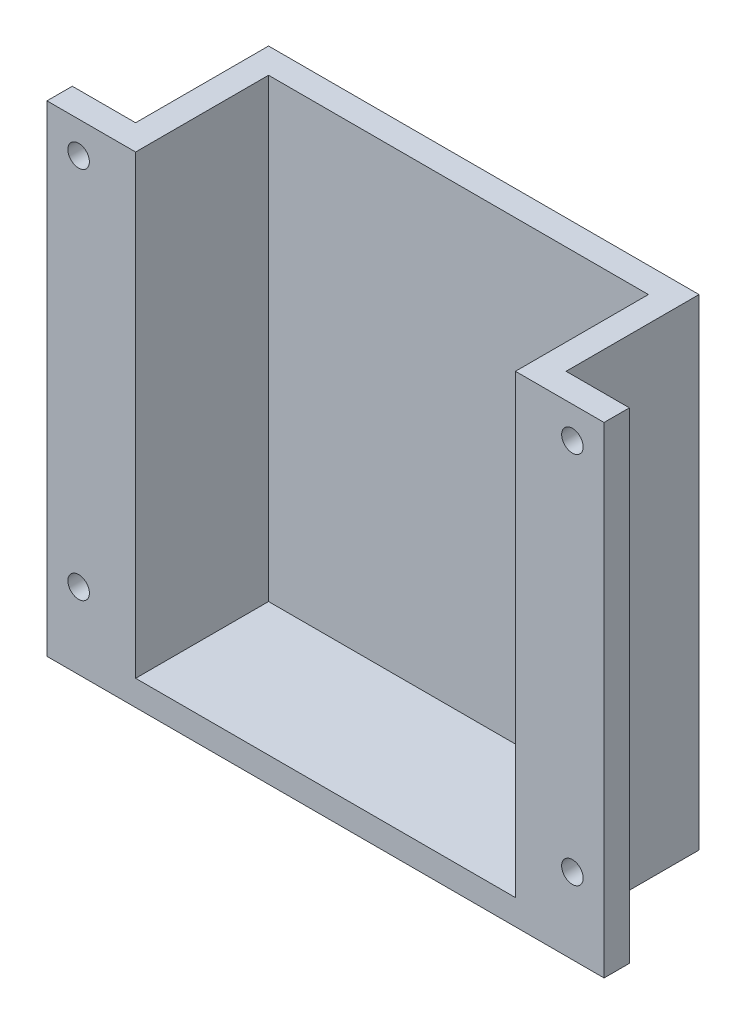
ISO-10303-21;
HEADER;
FILE_DESCRIPTION(('STEP AP214'),'2;1');
FILE_NAME('part.step','',(''),(''),'','','');
FILE_SCHEMA(('AUTOMOTIVE_DESIGN { 1 0 10303 214 1 1 1 1 }'));
ENDSEC;
DATA;
#1=APPLICATION_CONTEXT('core data for automotive mechanical design processes');
#2=APPLICATION_PROTOCOL_DEFINITION('international standard','automotive_design',2000,#1);
#3=PRODUCT_CONTEXT('',#1,'mechanical');
#4=PRODUCT('Part','Part','',(#3));
#5=PRODUCT_RELATED_PRODUCT_CATEGORY('part','',(#4));
#6=PRODUCT_DEFINITION_FORMATION('','',#4);
#7=PRODUCT_DEFINITION_CONTEXT('part definition',#1,'design');
#8=PRODUCT_DEFINITION('design','',#6,#7);
#9=PRODUCT_DEFINITION_SHAPE('','',#8);
#10=(LENGTH_UNIT() NAMED_UNIT(*) SI_UNIT(.MILLI.,.METRE.));
#11=(NAMED_UNIT(*) PLANE_ANGLE_UNIT() SI_UNIT($,.RADIAN.));
#12=(NAMED_UNIT(*) SI_UNIT($,.STERADIAN.) SOLID_ANGLE_UNIT());
#13=UNCERTAINTY_MEASURE_WITH_UNIT(LENGTH_MEASURE(1.E-05),#10,'distance_accuracy_value','');
#14=(GEOMETRIC_REPRESENTATION_CONTEXT(3) GLOBAL_UNCERTAINTY_ASSIGNED_CONTEXT((#13)) GLOBAL_UNIT_ASSIGNED_CONTEXT((#10,
#11,#12)) REPRESENTATION_CONTEXT('',''));
#15=CARTESIAN_POINT('',(0.,0.,0.));
#16=DIRECTION('',(0.,0.,1.));
#17=DIRECTION('',(1.,0.,0.));
#18=AXIS2_PLACEMENT_3D('',#15,#16,#17);
#19=CARTESIAN_POINT('',(29.8333333333333,76.,0.));
#20=DIRECTION('',(0.,0.,-1.));
#21=DIRECTION('',(-1.,0.,0.));
#22=AXIS2_PLACEMENT_3D('',#19,#20,#21);
#23=PLANE('',#22);
#24=CARTESIAN_POINT('',(34.8333333333333,12.,0.));
#25=DIRECTION('',(0.,0.,-1.));
#26=DIRECTION('',(-1.,0.,0.));
#27=AXIS2_PLACEMENT_3D('',#24,#25,#26);
#28=CIRCLE('',#27,1.7);
#29=CARTESIAN_POINT('',(33.1333333333333,12.,0.));
#30=VERTEX_POINT('',#29);
#31=EDGE_CURVE('E337',#30,#30,#28,.T.);
#32=ORIENTED_EDGE('',*,*,#31,.F.);
#33=EDGE_LOOP('',(#32));
#34=FACE_BOUND('',#33,.T.);
#35=CARTESIAN_POINT('',(34.8333333333333,71.,0.));
#36=DIRECTION('',(0.,0.,-1.));
#37=DIRECTION('',(-1.,0.,0.));
#38=AXIS2_PLACEMENT_3D('',#35,#36,#37);
#39=CIRCLE('',#38,1.7);
#40=CARTESIAN_POINT('',(33.1333333333333,71.,0.));
#41=VERTEX_POINT('',#40);
#42=EDGE_CURVE('E258',#41,#41,#39,.T.);
#43=ORIENTED_EDGE('',*,*,#42,.F.);
#44=EDGE_LOOP('',(#43));
#45=FACE_BOUND('',#44,.T.);
#46=DIRECTION('',(1.,0.,0.));
#47=VECTOR('',#46,1.);
#48=CARTESIAN_POINT('',(29.8333333333333,0.,0.));
#49=LINE('',#48,#47);
#50=CARTESIAN_POINT('',(29.8333333333333,0.,0.));
#51=VERTEX_POINT('',#50);
#52=CARTESIAN_POINT('',(39.8333333333333,0.,0.));
#53=VERTEX_POINT('',#52);
#54=EDGE_CURVE('E201',#51,#53,#49,.T.);
#55=ORIENTED_EDGE('',*,*,#54,.F.);
#56=DIRECTION('',(0.,-1.,0.));
#57=VECTOR('',#56,1.);
#58=CARTESIAN_POINT('',(29.8333333333333,76.,0.));
#59=LINE('',#58,#57);
#60=CARTESIAN_POINT('',(29.8333333333333,76.,0.));
#61=VERTEX_POINT('',#60);
#62=EDGE_CURVE('E11',#61,#51,#59,.T.);
#63=ORIENTED_EDGE('',*,*,#62,.F.);
#64=DIRECTION('',(1.,0.,0.));
#65=VECTOR('',#64,1.);
#66=CARTESIAN_POINT('',(29.8333333333333,76.,0.));
#67=LINE('',#66,#65);
#68=CARTESIAN_POINT('',(39.8333333333333,76.,0.));
#69=VERTEX_POINT('',#68);
#70=EDGE_CURVE('E152',#61,#69,#67,.T.);
#71=ORIENTED_EDGE('',*,*,#70,.T.);
#72=DIRECTION('',(0.,-1.,0.));
#73=VECTOR('',#72,1.);
#74=CARTESIAN_POINT('',(39.8333333333333,76.,0.));
#75=LINE('',#74,#73);
#76=EDGE_CURVE('E133',#69,#53,#75,.T.);
#77=ORIENTED_EDGE('',*,*,#76,.T.);
#78=EDGE_LOOP('',(#55,#63,#71,#77));
#79=FACE_BOUND('',#78,.T.);
#80=ADVANCED_FACE('F43',(#34,#45,#79),#23,.T.);
#81=CARTESIAN_POINT('',(29.8333333333333,76.,-21.));
#82=DIRECTION('',(1.,0.,0.));
#83=DIRECTION('',(0.,0.,-1.));
#84=AXIS2_PLACEMENT_3D('',#81,#82,#83);
#85=PLANE('',#84);
#86=DIRECTION('',(0.,0.,1.));
#87=VECTOR('',#86,1.);
#88=CARTESIAN_POINT('',(29.8333333333333,0.,-21.));
#89=LINE('',#88,#87);
#90=CARTESIAN_POINT('',(29.8333333333333,0.,-21.));
#91=VERTEX_POINT('',#90);
#92=EDGE_CURVE('E160',#91,#51,#89,.T.);
#93=ORIENTED_EDGE('',*,*,#92,.F.);
#94=DIRECTION('',(0.,-1.,0.));
#95=VECTOR('',#94,1.);
#96=CARTESIAN_POINT('',(29.8333333333333,76.,-21.));
#97=LINE('',#96,#95);
#98=CARTESIAN_POINT('',(29.8333333333333,76.,-21.));
#99=VERTEX_POINT('',#98);
#100=EDGE_CURVE('E52',#99,#91,#97,.T.);
#101=ORIENTED_EDGE('',*,*,#100,.F.);
#102=DIRECTION('',(0.,0.,1.));
#103=VECTOR('',#102,1.);
#104=CARTESIAN_POINT('',(29.8333333333333,76.,-21.));
#105=LINE('',#104,#103);
#106=EDGE_CURVE('E146',#99,#61,#105,.T.);
#107=ORIENTED_EDGE('',*,*,#106,.T.);
#108=ORIENTED_EDGE('',*,*,#62,.T.);
#109=EDGE_LOOP('',(#93,#101,#107,#108));
#110=FACE_BOUND('',#109,.T.);
#111=ADVANCED_FACE('F300',(#110),#85,.T.);
#112=CARTESIAN_POINT('',(-38.1666666666667,76.,-21.));
#113=DIRECTION('',(0.,0.,-1.));
#114=DIRECTION('',(-1.,0.,0.));
#115=AXIS2_PLACEMENT_3D('',#112,#113,#114);
#116=PLANE('',#115);
#117=DIRECTION('',(1.,0.,0.));
#118=VECTOR('',#117,1.);
#119=CARTESIAN_POINT('',(-38.1666666666667,0.,-21.));
#120=LINE('',#119,#118);
#121=CARTESIAN_POINT('',(-38.1666666666667,0.,-21.));
#122=VERTEX_POINT('',#121);
#123=EDGE_CURVE('E164',#122,#91,#120,.T.);
#124=ORIENTED_EDGE('',*,*,#123,.F.);
#125=DIRECTION('',(0.,-1.,0.));
#126=VECTOR('',#125,1.);
#127=CARTESIAN_POINT('',(-38.1666666666667,76.,-21.));
#128=LINE('',#127,#126);
#129=CARTESIAN_POINT('',(-38.1666666666667,76.,-21.));
#130=VERTEX_POINT('',#129);
#131=EDGE_CURVE('E225',#130,#122,#128,.T.);
#132=ORIENTED_EDGE('',*,*,#131,.F.);
#133=DIRECTION('',(1.,0.,0.));
#134=VECTOR('',#133,1.);
#135=CARTESIAN_POINT('',(-38.1666666666667,76.,-21.));
#136=LINE('',#135,#134);
#137=EDGE_CURVE('E195',#130,#99,#136,.T.);
#138=ORIENTED_EDGE('',*,*,#137,.T.);
#139=ORIENTED_EDGE('',*,*,#100,.T.);
#140=EDGE_LOOP('',(#124,#132,#138,#139));
#141=FACE_BOUND('',#140,.T.);
#142=ADVANCED_FACE('F332',(#141),#116,.T.);
#143=CARTESIAN_POINT('',(-38.1666666666667,76.,0.));
#144=DIRECTION('',(-1.,0.,0.));
#145=DIRECTION('',(0.,0.,1.));
#146=AXIS2_PLACEMENT_3D('',#143,#144,#145);
#147=PLANE('',#146);
#148=DIRECTION('',(0.,0.,-1.));
#149=VECTOR('',#148,1.);
#150=CARTESIAN_POINT('',(-38.1666666666667,0.,0.));
#151=LINE('',#150,#149);
#152=CARTESIAN_POINT('',(-38.1666666666667,0.,0.));
#153=VERTEX_POINT('',#152);
#154=EDGE_CURVE('E216',#153,#122,#151,.T.);
#155=ORIENTED_EDGE('',*,*,#154,.F.);
#156=DIRECTION('',(0.,-1.,0.));
#157=VECTOR('',#156,1.);
#158=CARTESIAN_POINT('',(-38.1666666666667,76.,0.));
#159=LINE('',#158,#157);
#160=CARTESIAN_POINT('',(-38.1666666666667,76.,0.));
#161=VERTEX_POINT('',#160);
#162=EDGE_CURVE('E228',#161,#153,#159,.T.);
#163=ORIENTED_EDGE('',*,*,#162,.F.);
#164=DIRECTION('',(0.,0.,-1.));
#165=VECTOR('',#164,1.);
#166=CARTESIAN_POINT('',(-38.1666666666667,76.,0.));
#167=LINE('',#166,#165);
#168=EDGE_CURVE('E191',#161,#130,#167,.T.);
#169=ORIENTED_EDGE('',*,*,#168,.T.);
#170=ORIENTED_EDGE('',*,*,#131,.T.);
#171=EDGE_LOOP('',(#155,#163,#169,#170));
#172=FACE_BOUND('',#171,.T.);
#173=ADVANCED_FACE('F307',(#172),#147,.T.);
#174=CARTESIAN_POINT('',(-48.1666666666667,76.,0.));
#175=DIRECTION('',(0.,0.,-1.));
#176=DIRECTION('',(-1.,0.,0.));
#177=AXIS2_PLACEMENT_3D('',#174,#175,#176);
#178=PLANE('',#177);
#179=CARTESIAN_POINT('',(-43.1666666666667,71.,0.));
#180=DIRECTION('',(0.,0.,-1.));
#181=DIRECTION('',(-1.,0.,0.));
#182=AXIS2_PLACEMENT_3D('',#179,#180,#181);
#183=CIRCLE('',#182,1.7);
#184=CARTESIAN_POINT('',(-44.8666666666667,71.,0.));
#185=VERTEX_POINT('',#184);
#186=EDGE_CURVE('E343',#185,#185,#183,.T.);
#187=ORIENTED_EDGE('',*,*,#186,.F.);
#188=EDGE_LOOP('',(#187));
#189=FACE_BOUND('',#188,.T.);
#190=CARTESIAN_POINT('',(-43.1666666666667,12.,0.));
#191=DIRECTION('',(0.,0.,-1.));
#192=DIRECTION('',(-1.,0.,0.));
#193=AXIS2_PLACEMENT_3D('',#190,#191,#192);
#194=CIRCLE('',#193,1.7);
#195=CARTESIAN_POINT('',(-44.8666666666667,12.,0.));
#196=VERTEX_POINT('',#195);
#197=EDGE_CURVE('E348',#196,#196,#194,.T.);
#198=ORIENTED_EDGE('',*,*,#197,.F.);
#199=EDGE_LOOP('',(#198));
#200=FACE_BOUND('',#199,.T.);
#201=DIRECTION('',(1.,0.,0.));
#202=VECTOR('',#201,1.);
#203=CARTESIAN_POINT('',(-48.1666666666667,0.,0.));
#204=LINE('',#203,#202);
#205=CARTESIAN_POINT('',(-48.1666666666667,0.,0.));
#206=VERTEX_POINT('',#205);
#207=EDGE_CURVE('E212',#206,#153,#204,.T.);
#208=ORIENTED_EDGE('',*,*,#207,.F.);
#209=DIRECTION('',(0.,-1.,0.));
#210=VECTOR('',#209,1.);
#211=CARTESIAN_POINT('',(-48.1666666666667,76.,0.));
#212=LINE('',#211,#210);
#213=CARTESIAN_POINT('',(-48.1666666666667,76.,0.));
#214=VERTEX_POINT('',#213);
#215=EDGE_CURVE('E231',#214,#206,#212,.T.);
#216=ORIENTED_EDGE('',*,*,#215,.F.);
#217=DIRECTION('',(1.,0.,0.));
#218=VECTOR('',#217,1.);
#219=CARTESIAN_POINT('',(-48.1666666666667,76.,0.));
#220=LINE('',#219,#218);
#221=EDGE_CURVE('E187',#214,#161,#220,.T.);
#222=ORIENTED_EDGE('',*,*,#221,.T.);
#223=ORIENTED_EDGE('',*,*,#162,.T.);
#224=EDGE_LOOP('',(#208,#216,#222,#223));
#225=FACE_BOUND('',#224,.T.);
#226=ADVANCED_FACE('F310',(#189,#200,#225),#178,.T.);
#227=CARTESIAN_POINT('',(-48.1666666666667,76.,0.));
#228=DIRECTION('',(1.,0.,0.));
#229=DIRECTION('',(0.,0.,-1.));
#230=AXIS2_PLACEMENT_3D('',#227,#228,#229);
#231=PLANE('',#230);
#232=DIRECTION('',(0.,0.,1.));
#233=VECTOR('',#232,1.);
#234=CARTESIAN_POINT('',(-48.1666666666667,0.,0.));
#235=LINE('',#234,#233);
#236=CARTESIAN_POINT('',(-48.1666666666667,0.,4.));
#237=VERTEX_POINT('',#236);
#238=EDGE_CURVE('E209',#206,#237,#235,.T.);
#239=ORIENTED_EDGE('',*,*,#238,.T.);
#240=DIRECTION('',(0.,-1.,0.));
#241=VECTOR('',#240,1.);
#242=CARTESIAN_POINT('',(-48.1666666666667,76.,4.));
#243=LINE('',#242,#241);
#244=CARTESIAN_POINT('',(-48.1666666666667,76.,4.));
#245=VERTEX_POINT('',#244);
#246=EDGE_CURVE('E234',#245,#237,#243,.T.);
#247=ORIENTED_EDGE('',*,*,#246,.F.);
#248=DIRECTION('',(0.,0.,1.));
#249=VECTOR('',#248,1.);
#250=CARTESIAN_POINT('',(-48.1666666666667,76.,0.));
#251=LINE('',#250,#249);
#252=EDGE_CURVE('E184',#214,#245,#251,.T.);
#253=ORIENTED_EDGE('',*,*,#252,.F.);
#254=ORIENTED_EDGE('',*,*,#215,.T.);
#255=EDGE_LOOP('',(#239,#247,#253,#254));
#256=FACE_BOUND('',#255,.T.);
#257=ADVANCED_FACE('F315',(#256),#231,.F.);
#258=CARTESIAN_POINT('',(-48.1666666666667,76.,4.));
#259=DIRECTION('',(0.,0.,-1.));
#260=DIRECTION('',(-1.,0.,0.));
#261=AXIS2_PLACEMENT_3D('',#258,#259,#260);
#262=PLANE('',#261);
#263=CARTESIAN_POINT('',(34.8333333333333,12.,4.));
#264=DIRECTION('',(0.,0.,-1.));
#265=DIRECTION('',(-1.,0.,0.));
#266=AXIS2_PLACEMENT_3D('',#263,#264,#265);
#267=CIRCLE('',#266,1.7);
#268=CARTESIAN_POINT('',(33.1333333333333,12.,4.));
#269=VERTEX_POINT('',#268);
#270=EDGE_CURVE('E46',#269,#269,#267,.T.);
#271=ORIENTED_EDGE('',*,*,#270,.T.);
#272=EDGE_LOOP('',(#271));
#273=FACE_BOUND('',#272,.T.);
#274=CARTESIAN_POINT('',(-43.1666666666667,71.,4.));
#275=DIRECTION('',(0.,0.,-1.));
#276=DIRECTION('',(-1.,0.,0.));
#277=AXIS2_PLACEMENT_3D('',#274,#275,#276);
#278=CIRCLE('',#277,1.7);
#279=CARTESIAN_POINT('',(-44.8666666666667,71.,4.));
#280=VERTEX_POINT('',#279);
#281=EDGE_CURVE('E261',#280,#280,#278,.T.);
#282=ORIENTED_EDGE('',*,*,#281,.T.);
#283=EDGE_LOOP('',(#282));
#284=FACE_BOUND('',#283,.T.);
#285=CARTESIAN_POINT('',(-43.1666666666667,12.,4.));
#286=DIRECTION('',(0.,0.,-1.));
#287=DIRECTION('',(-1.,0.,0.));
#288=AXIS2_PLACEMENT_3D('',#285,#286,#287);
#289=CIRCLE('',#288,1.7);
#290=CARTESIAN_POINT('',(-44.8666666666667,12.,4.));
#291=VERTEX_POINT('',#290);
#292=EDGE_CURVE('E257',#291,#291,#289,.T.);
#293=ORIENTED_EDGE('',*,*,#292,.T.);
#294=EDGE_LOOP('',(#293));
#295=FACE_BOUND('',#294,.T.);
#296=CARTESIAN_POINT('',(34.8333333333333,71.,4.));
#297=DIRECTION('',(0.,0.,-1.));
#298=DIRECTION('',(-1.,0.,0.));
#299=AXIS2_PLACEMENT_3D('',#296,#297,#298);
#300=CIRCLE('',#299,1.7);
#301=CARTESIAN_POINT('',(33.1333333333333,71.,4.));
#302=VERTEX_POINT('',#301);
#303=EDGE_CURVE('E253',#302,#302,#300,.T.);
#304=ORIENTED_EDGE('',*,*,#303,.T.);
#305=EDGE_LOOP('',(#304));
#306=FACE_BOUND('',#305,.T.);
#307=DIRECTION('',(1.,0.,0.));
#308=VECTOR('',#307,1.);
#309=CARTESIAN_POINT('',(-48.1666666666667,0.,4.));
#310=LINE('',#309,#308);
#311=CARTESIAN_POINT('',(39.8333333333333,0.,3.99999999999998));
#312=VERTEX_POINT('',#311);
#313=EDGE_CURVE('E206',#237,#312,#310,.T.);
#314=ORIENTED_EDGE('',*,*,#313,.T.);
#315=DIRECTION('',(0.,-1.,0.));
#316=VECTOR('',#315,1.);
#317=CARTESIAN_POINT('',(39.8333333333333,76.,3.99999999999998));
#318=LINE('',#317,#316);
#319=CARTESIAN_POINT('',(39.8333333333333,76.,3.99999999999998));
#320=VERTEX_POINT('',#319);
#321=EDGE_CURVE('E145',#320,#312,#318,.T.);
#322=ORIENTED_EDGE('',*,*,#321,.F.);
#323=DIRECTION('',(1.,0.,0.));
#324=VECTOR('',#323,1.);
#325=CARTESIAN_POINT('',(25.8333333333333,76.,3.99999999999999));
#326=LINE('',#325,#324);
#327=CARTESIAN_POINT('',(25.8333333333333,76.,3.99999999999999));
#328=VERTEX_POINT('',#327);
#329=EDGE_CURVE('E155',#328,#320,#326,.T.);
#330=ORIENTED_EDGE('',*,*,#329,.F.);
#331=DIRECTION('',(0.,-1.,0.));
#332=VECTOR('',#331,1.);
#333=CARTESIAN_POINT('',(25.8333333333333,76.,3.99999999999999));
#334=LINE('',#333,#332);
#335=CARTESIAN_POINT('',(25.8333333333333,4.,3.99999999999999));
#336=VERTEX_POINT('',#335);
#337=EDGE_CURVE('E247',#328,#336,#334,.T.);
#338=ORIENTED_EDGE('',*,*,#337,.T.);
#339=DIRECTION('',(1.,0.,0.));
#340=VECTOR('',#339,1.);
#341=CARTESIAN_POINT('',(-34.1666666666667,4.,3.99999999999995));
#342=LINE('',#341,#340);
#343=CARTESIAN_POINT('',(-34.1666666666667,4.,4.));
#344=VERTEX_POINT('',#343);
#345=EDGE_CURVE('E272',#344,#336,#342,.T.);
#346=ORIENTED_EDGE('',*,*,#345,.F.);
#347=DIRECTION('',(0.,-1.,0.));
#348=VECTOR('',#347,1.);
#349=CARTESIAN_POINT('',(-34.1666666666667,76.,4.));
#350=LINE('',#349,#348);
#351=CARTESIAN_POINT('',(-34.1666666666667,76.,4.));
#352=VERTEX_POINT('',#351);
#353=EDGE_CURVE('E60',#352,#344,#350,.T.);
#354=ORIENTED_EDGE('',*,*,#353,.F.);
#355=DIRECTION('',(1.,0.,0.));
#356=VECTOR('',#355,1.);
#357=CARTESIAN_POINT('',(-48.1666666666667,76.,4.));
#358=LINE('',#357,#356);
#359=EDGE_CURVE('E181',#245,#352,#358,.T.);
#360=ORIENTED_EDGE('',*,*,#359,.F.);
#361=ORIENTED_EDGE('',*,*,#246,.T.);
#362=EDGE_LOOP('',(#314,#322,#330,#338,#346,#354,#360,#361));
#363=FACE_BOUND('',#362,.T.);
#364=ADVANCED_FACE('F292',(#273,#284,#295,#306,#363),#262,.F.);
#365=CARTESIAN_POINT('',(-34.1666666666667,76.,4.));
#366=DIRECTION('',(-1.,0.,0.));
#367=DIRECTION('',(0.,0.,1.));
#368=AXIS2_PLACEMENT_3D('',#365,#366,#367);
#369=PLANE('',#368);
#370=ORIENTED_EDGE('',*,*,#353,.T.);
#371=DIRECTION('',(0.,0.,-1.));
#372=VECTOR('',#371,1.);
#373=CARTESIAN_POINT('',(-34.1666666666667,4.,3.99999999999995));
#374=LINE('',#373,#372);
#375=CARTESIAN_POINT('',(-34.1666666666667,4.,-17.));
#376=VERTEX_POINT('',#375);
#377=EDGE_CURVE('E64',#344,#376,#374,.T.);
#378=ORIENTED_EDGE('',*,*,#377,.T.);
#379=DIRECTION('',(0.,-1.,0.));
#380=VECTOR('',#379,1.);
#381=CARTESIAN_POINT('',(-34.1666666666667,76.,-17.));
#382=LINE('',#381,#380);
#383=CARTESIAN_POINT('',(-34.1666666666667,76.,-17.));
#384=VERTEX_POINT('',#383);
#385=EDGE_CURVE('E240',#384,#376,#382,.T.);
#386=ORIENTED_EDGE('',*,*,#385,.F.);
#387=DIRECTION('',(0.,0.,-1.));
#388=VECTOR('',#387,1.);
#389=CARTESIAN_POINT('',(-34.1666666666667,76.,4.));
#390=LINE('',#389,#388);
#391=EDGE_CURVE('E178',#352,#384,#390,.T.);
#392=ORIENTED_EDGE('',*,*,#391,.F.);
#393=EDGE_LOOP('',(#370,#378,#386,#392));
#394=FACE_BOUND('',#393,.T.);
#395=ADVANCED_FACE('F316',(#394),#369,.F.);
#396=CARTESIAN_POINT('',(-34.1666666666667,76.,-17.));
#397=DIRECTION('',(0.,0.,-1.));
#398=DIRECTION('',(-1.,0.,0.));
#399=AXIS2_PLACEMENT_3D('',#396,#397,#398);
#400=PLANE('',#399);
#401=ORIENTED_EDGE('',*,*,#385,.T.);
#402=DIRECTION('',(1.,0.,0.));
#403=VECTOR('',#402,1.);
#404=CARTESIAN_POINT('',(-34.1666666666667,4.,-17.));
#405=LINE('',#404,#403);
#406=CARTESIAN_POINT('',(25.8333333333333,4.,-17.));
#407=VERTEX_POINT('',#406);
#408=EDGE_CURVE('E268',#376,#407,#405,.T.);
#409=ORIENTED_EDGE('',*,*,#408,.T.);
#410=DIRECTION('',(0.,-1.,0.));
#411=VECTOR('',#410,1.);
#412=CARTESIAN_POINT('',(25.8333333333333,76.,-17.));
#413=LINE('',#412,#411);
#414=CARTESIAN_POINT('',(25.8333333333333,76.,-17.));
#415=VERTEX_POINT('',#414);
#416=EDGE_CURVE('E243',#415,#407,#413,.T.);
#417=ORIENTED_EDGE('',*,*,#416,.F.);
#418=DIRECTION('',(1.,0.,0.));
#419=VECTOR('',#418,1.);
#420=CARTESIAN_POINT('',(-34.1666666666667,76.,-17.));
#421=LINE('',#420,#419);
#422=EDGE_CURVE('E175',#384,#415,#421,.T.);
#423=ORIENTED_EDGE('',*,*,#422,.F.);
#424=EDGE_LOOP('',(#401,#409,#417,#423));
#425=FACE_BOUND('',#424,.T.);
#426=ADVANCED_FACE('F318',(#425),#400,.F.);
#427=CARTESIAN_POINT('',(25.8333333333333,76.,-17.));
#428=DIRECTION('',(1.,0.,0.));
#429=DIRECTION('',(0.,0.,-1.));
#430=AXIS2_PLACEMENT_3D('',#427,#428,#429);
#431=PLANE('',#430);
#432=ORIENTED_EDGE('',*,*,#416,.T.);
#433=DIRECTION('',(0.,0.,-1.));
#434=VECTOR('',#433,1.);
#435=CARTESIAN_POINT('',(25.8333333333333,4.,3.99999999999995));
#436=LINE('',#435,#434);
#437=EDGE_CURVE('E167',#336,#407,#436,.T.);
#438=ORIENTED_EDGE('',*,*,#437,.F.);
#439=ORIENTED_EDGE('',*,*,#337,.F.);
#440=DIRECTION('',(0.,0.,1.));
#441=VECTOR('',#440,1.);
#442=CARTESIAN_POINT('',(25.8333333333333,76.,-17.));
#443=LINE('',#442,#441);
#444=EDGE_CURVE('E172',#415,#328,#443,.T.);
#445=ORIENTED_EDGE('',*,*,#444,.F.);
#446=EDGE_LOOP('',(#432,#438,#439,#445));
#447=FACE_BOUND('',#446,.T.);
#448=ADVANCED_FACE('F289',(#447),#431,.F.);
#449=CARTESIAN_POINT('',(39.8333333333333,76.,0.));
#450=DIRECTION('',(1.,0.,0.));
#451=DIRECTION('',(0.,0.,-1.));
#452=AXIS2_PLACEMENT_3D('',#449,#450,#451);
#453=PLANE('',#452);
#454=DIRECTION('',(0.,0.,1.));
#455=VECTOR('',#454,1.);
#456=CARTESIAN_POINT('',(39.8333333333333,0.,0.));
#457=LINE('',#456,#455);
#458=EDGE_CURVE('E139',#53,#312,#457,.T.);
#459=ORIENTED_EDGE('',*,*,#458,.F.);
#460=ORIENTED_EDGE('',*,*,#76,.F.);
#461=DIRECTION('',(0.,0.,1.));
#462=VECTOR('',#461,1.);
#463=CARTESIAN_POINT('',(39.8333333333333,76.,0.));
#464=LINE('',#463,#462);
#465=EDGE_CURVE('E137',#69,#320,#464,.T.);
#466=ORIENTED_EDGE('',*,*,#465,.T.);
#467=ORIENTED_EDGE('',*,*,#321,.T.);
#468=EDGE_LOOP('',(#459,#460,#466,#467));
#469=FACE_BOUND('',#468,.T.);
#470=ADVANCED_FACE('F135',(#469),#453,.T.);
#471=CARTESIAN_POINT('',(0.,76.,0.));
#472=DIRECTION('',(0.,-1.,0.));
#473=DIRECTION('',(0.,0.,-1.));
#474=AXIS2_PLACEMENT_3D('',#471,#472,#473);
#475=PLANE('',#474);
#476=ORIENTED_EDGE('',*,*,#70,.F.);
#477=ORIENTED_EDGE('',*,*,#106,.F.);
#478=ORIENTED_EDGE('',*,*,#137,.F.);
#479=ORIENTED_EDGE('',*,*,#168,.F.);
#480=ORIENTED_EDGE('',*,*,#221,.F.);
#481=ORIENTED_EDGE('',*,*,#252,.T.);
#482=ORIENTED_EDGE('',*,*,#359,.T.);
#483=ORIENTED_EDGE('',*,*,#391,.T.);
#484=ORIENTED_EDGE('',*,*,#422,.T.);
#485=ORIENTED_EDGE('',*,*,#444,.T.);
#486=ORIENTED_EDGE('',*,*,#329,.T.);
#487=ORIENTED_EDGE('',*,*,#465,.F.);
#488=EDGE_LOOP('',(#476,#477,#478,#479,#480,#481,#482,#483,#484,#485,#486,#487));
#489=FACE_BOUND('',#488,.T.);
#490=ADVANCED_FACE('F150',(#489),#475,.F.);
#491=CARTESIAN_POINT('',(0.,0.,0.));
#492=DIRECTION('',(0.,-1.,0.));
#493=DIRECTION('',(0.,0.,-1.));
#494=AXIS2_PLACEMENT_3D('',#491,#492,#493);
#495=PLANE('',#494);
#496=ORIENTED_EDGE('',*,*,#458,.T.);
#497=ORIENTED_EDGE('',*,*,#313,.F.);
#498=ORIENTED_EDGE('',*,*,#238,.F.);
#499=ORIENTED_EDGE('',*,*,#207,.T.);
#500=ORIENTED_EDGE('',*,*,#154,.T.);
#501=ORIENTED_EDGE('',*,*,#123,.T.);
#502=ORIENTED_EDGE('',*,*,#92,.T.);
#503=ORIENTED_EDGE('',*,*,#54,.T.);
#504=EDGE_LOOP('',(#496,#497,#498,#499,#500,#501,#502,#503));
#505=FACE_BOUND('',#504,.T.);
#506=ADVANCED_FACE('F295',(#505),#495,.T.);
#507=CARTESIAN_POINT('',(-34.1666666666667,4.,3.99999999999995));
#508=DIRECTION('',(0.,1.,0.));
#509=DIRECTION('',(0.,0.,1.));
#510=AXIS2_PLACEMENT_3D('',#507,#508,#509);
#511=PLANE('',#510);
#512=ORIENTED_EDGE('',*,*,#408,.F.);
#513=ORIENTED_EDGE('',*,*,#377,.F.);
#514=ORIENTED_EDGE('',*,*,#345,.T.);
#515=ORIENTED_EDGE('',*,*,#437,.T.);
#516=EDGE_LOOP('',(#512,#513,#514,#515));
#517=FACE_BOUND('',#516,.T.);
#518=ADVANCED_FACE('F285',(#517),#511,.T.);
#519=CARTESIAN_POINT('',(34.8333333333334,71.,20.9999999999999));
#520=DIRECTION('',(0.,0.,-1.));
#521=DIRECTION('',(-1.,0.,0.));
#522=AXIS2_PLACEMENT_3D('',#519,#520,#521);
#523=CYLINDRICAL_SURFACE('',#522,1.7);
#524=ORIENTED_EDGE('',*,*,#42,.T.);
#525=EDGE_LOOP('',(#524));
#526=FACE_BOUND('',#525,.T.);
#527=ORIENTED_EDGE('',*,*,#303,.F.);
#528=EDGE_LOOP('',(#527));
#529=FACE_BOUND('',#528,.T.);
#530=ADVANCED_FACE('F377',(#526,#529),#523,.F.);
#531=CARTESIAN_POINT('',(-43.1666666666667,12.,21.));
#532=DIRECTION('',(0.,0.,-1.));
#533=DIRECTION('',(-1.,0.,0.));
#534=AXIS2_PLACEMENT_3D('',#531,#532,#533);
#535=CYLINDRICAL_SURFACE('',#534,1.7);
#536=ORIENTED_EDGE('',*,*,#197,.T.);
#537=EDGE_LOOP('',(#536));
#538=FACE_BOUND('',#537,.T.);
#539=ORIENTED_EDGE('',*,*,#292,.F.);
#540=EDGE_LOOP('',(#539));
#541=FACE_BOUND('',#540,.T.);
#542=ADVANCED_FACE('F354',(#538,#541),#535,.F.);
#543=CARTESIAN_POINT('',(-43.1666666666667,71.,21.));
#544=DIRECTION('',(0.,0.,-1.));
#545=DIRECTION('',(-1.,0.,0.));
#546=AXIS2_PLACEMENT_3D('',#543,#544,#545);
#547=CYLINDRICAL_SURFACE('',#546,1.7);
#548=ORIENTED_EDGE('',*,*,#186,.T.);
#549=EDGE_LOOP('',(#548));
#550=FACE_BOUND('',#549,.T.);
#551=ORIENTED_EDGE('',*,*,#281,.F.);
#552=EDGE_LOOP('',(#551));
#553=FACE_BOUND('',#552,.T.);
#554=ADVANCED_FACE('F384',(#550,#553),#547,.F.);
#555=CARTESIAN_POINT('',(34.8333333333334,12.,20.9999999999999));
#556=DIRECTION('',(0.,0.,-1.));
#557=DIRECTION('',(-1.,0.,0.));
#558=AXIS2_PLACEMENT_3D('',#555,#556,#557);
#559=CYLINDRICAL_SURFACE('',#558,1.7);
#560=ORIENTED_EDGE('',*,*,#31,.T.);
#561=EDGE_LOOP('',(#560));
#562=FACE_BOUND('',#561,.T.);
#563=ORIENTED_EDGE('',*,*,#270,.F.);
#564=EDGE_LOOP('',(#563));
#565=FACE_BOUND('',#564,.T.);
#566=ADVANCED_FACE('F496',(#562,#565),#559,.F.);
#567=CLOSED_SHELL('',(#80,#111,#142,#173,#226,#257,#364,#395,#426,#448,#470,#490,#506,#518,#530,
#542,#554,#566));
#568=MANIFOLD_SOLID_BREP('B2',#567);
#569=ADVANCED_BREP_SHAPE_REPRESENTATION('',(#18,#568),#14);
#570=SHAPE_DEFINITION_REPRESENTATION(#9,#569);
ENDSEC;
END-ISO-10303-21;
